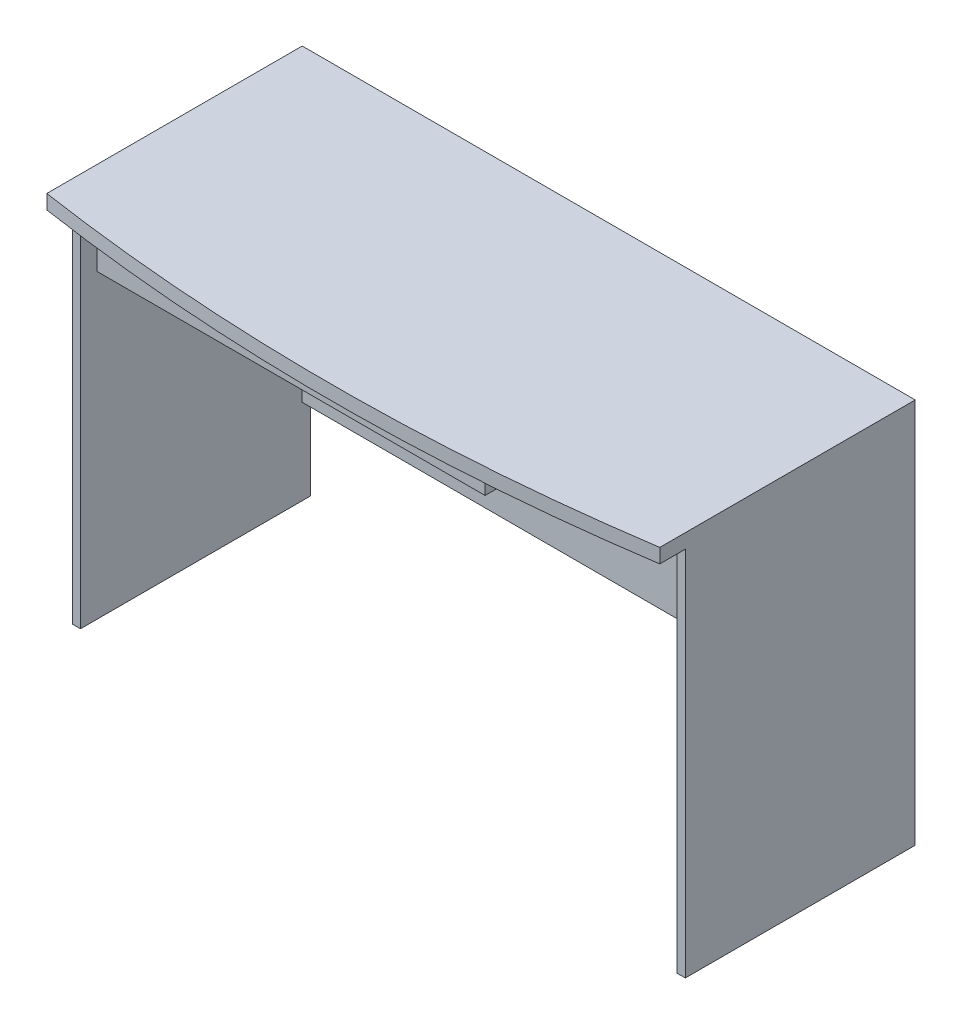
ISO-10303-21;
HEADER;
FILE_DESCRIPTION(('STEP AP214'),'2;1');
FILE_NAME('part.step','',(''),(''),'','','');
FILE_SCHEMA(('AUTOMOTIVE_DESIGN { 1 0 10303 214 1 1 1 1 }'));
ENDSEC;
DATA;
#1=APPLICATION_CONTEXT('core data for automotive mechanical design processes');
#2=APPLICATION_PROTOCOL_DEFINITION('international standard','automotive_design',2000,#1);
#3=PRODUCT_CONTEXT('',#1,'mechanical');
#4=PRODUCT('Part','Part','',(#3));
#5=PRODUCT_RELATED_PRODUCT_CATEGORY('part','',(#4));
#6=PRODUCT_DEFINITION_FORMATION('','',#4);
#7=PRODUCT_DEFINITION_CONTEXT('part definition',#1,'design');
#8=PRODUCT_DEFINITION('design','',#6,#7);
#9=PRODUCT_DEFINITION_SHAPE('','',#8);
#10=(LENGTH_UNIT() NAMED_UNIT(*) SI_UNIT(.MILLI.,.METRE.));
#11=(NAMED_UNIT(*) PLANE_ANGLE_UNIT() SI_UNIT($,.RADIAN.));
#12=(NAMED_UNIT(*) SI_UNIT($,.STERADIAN.) SOLID_ANGLE_UNIT());
#13=UNCERTAINTY_MEASURE_WITH_UNIT(LENGTH_MEASURE(1.E-05),#10,'distance_accuracy_value','');
#14=(GEOMETRIC_REPRESENTATION_CONTEXT(3) GLOBAL_UNCERTAINTY_ASSIGNED_CONTEXT((#13)) GLOBAL_UNIT_ASSIGNED_CONTEXT((#10,
#11,#12)) REPRESENTATION_CONTEXT('',''));
#15=CARTESIAN_POINT('',(0.,0.,0.));
#16=DIRECTION('',(0.,0.,1.));
#17=DIRECTION('',(1.,0.,0.));
#18=AXIS2_PLACEMENT_3D('',#15,#16,#17);
#19=CARTESIAN_POINT('',(0.,0.,-3727.5));
#20=DIRECTION('',(0.,1.,0.));
#21=DIRECTION('',(0.,0.,1.));
#22=AXIS2_PLACEMENT_3D('',#19,#20,#21);
#23=PLANE('',#22);
#24=DIRECTION('',(0.,0.,1.));
#25=VECTOR('',#24,1.);
#26=CARTESIAN_POINT('',(584.,0.,-250.));
#27=LINE('',#26,#25);
#28=CARTESIAN_POINT('',(584.,0.,-250.));
#29=VERTEX_POINT('',#28);
#30=CARTESIAN_POINT('',(584.,0.,200.));
#31=VERTEX_POINT('',#30);
#32=EDGE_CURVE('E221',#29,#31,#27,.T.);
#33=ORIENTED_EDGE('',*,*,#32,.T.);
#34=DIRECTION('',(1.,0.,0.));
#35=VECTOR('',#34,1.);
#36=CARTESIAN_POINT('',(600.,0.,200.));
#37=LINE('',#36,#35);
#38=CARTESIAN_POINT('',(600.,0.,200.));
#39=VERTEX_POINT('',#38);
#40=EDGE_CURVE('E196',#31,#39,#37,.T.);
#41=ORIENTED_EDGE('',*,*,#40,.T.);
#42=DIRECTION('',(0.,0.,-1.));
#43=VECTOR('',#42,1.);
#44=CARTESIAN_POINT('',(600.,0.,250.));
#45=LINE('',#44,#43);
#46=CARTESIAN_POINT('',(600.000000000001,0.,250.));
#47=VERTEX_POINT('',#46);
#48=EDGE_CURVE('E266',#47,#39,#45,.T.);
#49=ORIENTED_EDGE('',*,*,#48,.F.);
#50=CARTESIAN_POINT('',(0.,0.,-3727.5));
#51=DIRECTION('',(0.,1.,0.));
#52=DIRECTION('',(0.,0.,1.));
#53=AXIS2_PLACEMENT_3D('',#50,#51,#52);
#54=CIRCLE('',#53,4022.5);
#55=CARTESIAN_POINT('',(-600.,0.,250.));
#56=VERTEX_POINT('',#55);
#57=EDGE_CURVE('E271',#56,#47,#54,.T.);
#58=ORIENTED_EDGE('',*,*,#57,.F.);
#59=DIRECTION('',(0.,0.,1.));
#60=VECTOR('',#59,1.);
#61=CARTESIAN_POINT('',(-600.,0.,250.));
#62=LINE('',#61,#60);
#63=CARTESIAN_POINT('',(-600.,0.,200.));
#64=VERTEX_POINT('',#63);
#65=EDGE_CURVE('E283',#64,#56,#62,.T.);
#66=ORIENTED_EDGE('',*,*,#65,.F.);
#67=DIRECTION('',(-1.,0.,0.));
#68=VECTOR('',#67,1.);
#69=CARTESIAN_POINT('',(-600.,0.,200.));
#70=LINE('',#69,#68);
#71=CARTESIAN_POINT('',(-584.,0.,200.));
#72=VERTEX_POINT('',#71);
#73=EDGE_CURVE('E247',#72,#64,#70,.T.);
#74=ORIENTED_EDGE('',*,*,#73,.F.);
#75=DIRECTION('',(0.,0.,1.));
#76=VECTOR('',#75,1.);
#77=CARTESIAN_POINT('',(-584.,0.,-250.));
#78=LINE('',#77,#76);
#79=CARTESIAN_POINT('',(-584.,0.,-250.));
#80=VERTEX_POINT('',#79);
#81=EDGE_CURVE('E242',#80,#72,#78,.T.);
#82=ORIENTED_EDGE('',*,*,#81,.F.);
#83=DIRECTION('',(-1.,0.,0.));
#84=VECTOR('',#83,1.);
#85=CARTESIAN_POINT('',(-600.,0.,-250.));
#86=LINE('',#85,#84);
#87=EDGE_CURVE('E280',#29,#80,#86,.T.);
#88=ORIENTED_EDGE('',*,*,#87,.F.);
#89=EDGE_LOOP('',(#33,#41,#49,#58,#66,#74,#82,#88));
#90=FACE_BOUND('',#89,.T.);
#91=DIRECTION('',(0.,0.,-1.));
#92=VECTOR('',#91,1.);
#93=CARTESIAN_POINT('',(-517.,0.,235.));
#94=LINE('',#93,#92);
#95=CARTESIAN_POINT('',(-517.,0.,235.));
#96=VERTEX_POINT('',#95);
#97=CARTESIAN_POINT('',(-517.,0.,-195.));
#98=VERTEX_POINT('',#97);
#99=EDGE_CURVE('E181',#96,#98,#94,.T.);
#100=ORIENTED_EDGE('',*,*,#99,.F.);
#101=DIRECTION('',(-1.,0.,0.));
#102=VECTOR('',#101,1.);
#103=CARTESIAN_POINT('',(-517.,0.,235.));
#104=LINE('',#103,#102);
#105=CARTESIAN_POINT('',(243.,0.,235.));
#106=VERTEX_POINT('',#105);
#107=EDGE_CURVE('E178',#106,#96,#104,.T.);
#108=ORIENTED_EDGE('',*,*,#107,.F.);
#109=DIRECTION('',(0.,0.,1.));
#110=VECTOR('',#109,1.);
#111=CARTESIAN_POINT('',(243.,0.,235.));
#112=LINE('',#111,#110);
#113=CARTESIAN_POINT('',(243.,0.,-195.));
#114=VERTEX_POINT('',#113);
#115=EDGE_CURVE('E57',#114,#106,#112,.T.);
#116=ORIENTED_EDGE('',*,*,#115,.F.);
#117=DIRECTION('',(1.,0.,0.));
#118=VECTOR('',#117,1.);
#119=CARTESIAN_POINT('',(-517.,0.,-195.));
#120=LINE('',#119,#118);
#121=EDGE_CURVE('E52',#98,#114,#120,.T.);
#122=ORIENTED_EDGE('',*,*,#121,.F.);
#123=EDGE_LOOP('',(#100,#108,#116,#122));
#124=FACE_BOUND('',#123,.T.);
#125=ADVANCED_FACE('F37',(#90,#124),#23,.F.);
#126=CARTESIAN_POINT('',(-584.,-727.,-250.));
#127=DIRECTION('',(-1.,0.,0.));
#128=DIRECTION('',(0.,0.,1.));
#129=AXIS2_PLACEMENT_3D('',#126,#127,#128);
#130=PLANE('',#129);
#131=DIRECTION('',(0.,0.,-1.));
#132=VECTOR('',#131,1.);
#133=CARTESIAN_POINT('',(-584.,-560.,-250.));
#134=LINE('',#133,#132);
#135=CARTESIAN_POINT('',(-584.,-560.,-234.));
#136=VERTEX_POINT('',#135);
#137=CARTESIAN_POINT('',(-584.,-560.,-250.));
#138=VERTEX_POINT('',#137);
#139=EDGE_CURVE('E200',#136,#138,#134,.T.);
#140=ORIENTED_EDGE('',*,*,#139,.F.);
#141=DIRECTION('',(0.,-1.,0.));
#142=VECTOR('',#141,1.);
#143=CARTESIAN_POINT('',(-584.,-260.,-234.));
#144=LINE('',#143,#142);
#145=CARTESIAN_POINT('',(-584.,-260.,-234.));
#146=VERTEX_POINT('',#145);
#147=EDGE_CURVE('E185',#146,#136,#144,.T.);
#148=ORIENTED_EDGE('',*,*,#147,.F.);
#149=DIRECTION('',(0.,0.,1.));
#150=VECTOR('',#149,1.);
#151=CARTESIAN_POINT('',(-584.,-260.,-250.));
#152=LINE('',#151,#150);
#153=CARTESIAN_POINT('',(-584.,-260.,-250.));
#154=VERTEX_POINT('',#153);
#155=EDGE_CURVE('E182',#154,#146,#152,.T.);
#156=ORIENTED_EDGE('',*,*,#155,.F.);
#157=DIRECTION('',(0.,1.,0.));
#158=VECTOR('',#157,1.);
#159=CARTESIAN_POINT('',(-584.,-727.,-250.));
#160=LINE('',#159,#158);
#161=EDGE_CURVE('E263',#154,#80,#160,.T.);
#162=ORIENTED_EDGE('',*,*,#161,.T.);
#163=ORIENTED_EDGE('',*,*,#81,.T.);
#164=DIRECTION('',(0.,1.,0.));
#165=VECTOR('',#164,1.);
#166=CARTESIAN_POINT('',(-584.,-727.,200.));
#167=LINE('',#166,#165);
#168=CARTESIAN_POINT('',(-584.,-727.,200.));
#169=VERTEX_POINT('',#168);
#170=EDGE_CURVE('E260',#169,#72,#167,.T.);
#171=ORIENTED_EDGE('',*,*,#170,.F.);
#172=DIRECTION('',(0.,0.,1.));
#173=VECTOR('',#172,1.);
#174=CARTESIAN_POINT('',(-584.,-727.,-250.));
#175=LINE('',#174,#173);
#176=CARTESIAN_POINT('',(-584.,-727.,-250.));
#177=VERTEX_POINT('',#176);
#178=EDGE_CURVE('E249',#177,#169,#175,.T.);
#179=ORIENTED_EDGE('',*,*,#178,.F.);
#180=EDGE_CURVE('E264',#177,#138,#160,.T.);
#181=ORIENTED_EDGE('',*,*,#180,.T.);
#182=EDGE_LOOP('',(#140,#148,#156,#162,#163,#171,#179,#181));
#183=FACE_BOUND('',#182,.T.);
#184=ADVANCED_FACE('F335',(#183),#130,.F.);
#185=CARTESIAN_POINT('',(584.,-727.,-250.));
#186=DIRECTION('',(-1.,0.,0.));
#187=DIRECTION('',(0.,0.,1.));
#188=AXIS2_PLACEMENT_3D('',#185,#186,#187);
#189=PLANE('',#188);
#190=DIRECTION('',(0.,1.,0.));
#191=VECTOR('',#190,1.);
#192=CARTESIAN_POINT('',(584.,-260.,-234.));
#193=LINE('',#192,#191);
#194=CARTESIAN_POINT('',(584.,-560.,-234.));
#195=VERTEX_POINT('',#194);
#196=CARTESIAN_POINT('',(584.,-260.,-234.));
#197=VERTEX_POINT('',#196);
#198=EDGE_CURVE('E191',#195,#197,#193,.T.);
#199=ORIENTED_EDGE('',*,*,#198,.F.);
#200=DIRECTION('',(0.,0.,1.));
#201=VECTOR('',#200,1.);
#202=CARTESIAN_POINT('',(584.,-560.,-250.));
#203=LINE('',#202,#201);
#204=CARTESIAN_POINT('',(584.,-560.,-250.));
#205=VERTEX_POINT('',#204);
#206=EDGE_CURVE('E195',#205,#195,#203,.T.);
#207=ORIENTED_EDGE('',*,*,#206,.F.);
#208=DIRECTION('',(0.,1.,0.));
#209=VECTOR('',#208,1.);
#210=CARTESIAN_POINT('',(584.,-727.,-250.));
#211=LINE('',#210,#209);
#212=CARTESIAN_POINT('',(584.,-727.,-250.));
#213=VERTEX_POINT('',#212);
#214=EDGE_CURVE('E235',#213,#205,#211,.T.);
#215=ORIENTED_EDGE('',*,*,#214,.F.);
#216=DIRECTION('',(0.,0.,1.));
#217=VECTOR('',#216,1.);
#218=CARTESIAN_POINT('',(584.,-727.,-250.));
#219=LINE('',#218,#217);
#220=CARTESIAN_POINT('',(584.,-727.,200.));
#221=VERTEX_POINT('',#220);
#222=EDGE_CURVE('E224',#213,#221,#219,.T.);
#223=ORIENTED_EDGE('',*,*,#222,.T.);
#224=DIRECTION('',(0.,1.,0.));
#225=VECTOR('',#224,1.);
#226=CARTESIAN_POINT('',(584.,-727.,200.));
#227=LINE('',#226,#225);
#228=EDGE_CURVE('E238',#221,#31,#227,.T.);
#229=ORIENTED_EDGE('',*,*,#228,.T.);
#230=ORIENTED_EDGE('',*,*,#32,.F.);
#231=CARTESIAN_POINT('',(584.,-260.,-250.));
#232=VERTEX_POINT('',#231);
#233=EDGE_CURVE('E230',#232,#29,#211,.T.);
#234=ORIENTED_EDGE('',*,*,#233,.F.);
#235=DIRECTION('',(0.,0.,-1.));
#236=VECTOR('',#235,1.);
#237=CARTESIAN_POINT('',(584.,-260.,-250.));
#238=LINE('',#237,#236);
#239=EDGE_CURVE('E194',#197,#232,#238,.T.);
#240=ORIENTED_EDGE('',*,*,#239,.F.);
#241=EDGE_LOOP('',(#199,#207,#215,#223,#229,#230,#234,#240));
#242=FACE_BOUND('',#241,.T.);
#243=ADVANCED_FACE('F329',(#242),#189,.T.);
#244=CARTESIAN_POINT('',(600.,28.,250.));
#245=DIRECTION('',(-1.,0.,0.));
#246=DIRECTION('',(0.,0.,1.));
#247=AXIS2_PLACEMENT_3D('',#244,#245,#246);
#248=PLANE('',#247);
#249=ORIENTED_EDGE('',*,*,#48,.T.);
#250=DIRECTION('',(0.,1.,0.));
#251=VECTOR('',#250,1.);
#252=CARTESIAN_POINT('',(600.,-727.,200.));
#253=LINE('',#252,#251);
#254=CARTESIAN_POINT('',(600.,-727.,200.));
#255=VERTEX_POINT('',#254);
#256=EDGE_CURVE('E240',#255,#39,#253,.T.);
#257=ORIENTED_EDGE('',*,*,#256,.F.);
#258=DIRECTION('',(0.,0.,-1.));
#259=VECTOR('',#258,1.);
#260=CARTESIAN_POINT('',(600.,-727.,-250.));
#261=LINE('',#260,#259);
#262=CARTESIAN_POINT('',(600.,-727.,-250.));
#263=VERTEX_POINT('',#262);
#264=EDGE_CURVE('E217',#255,#263,#261,.T.);
#265=ORIENTED_EDGE('',*,*,#264,.T.);
#266=DIRECTION('',(0.,-1.,0.));
#267=VECTOR('',#266,1.);
#268=CARTESIAN_POINT('',(600.,28.,-250.));
#269=LINE('',#268,#267);
#270=CARTESIAN_POINT('',(600.,28.,-250.));
#271=VERTEX_POINT('',#270);
#272=EDGE_CURVE('E11',#271,#263,#269,.T.);
#273=ORIENTED_EDGE('',*,*,#272,.F.);
#274=DIRECTION('',(0.,0.,-1.));
#275=VECTOR('',#274,1.);
#276=CARTESIAN_POINT('',(600.,28.,250.));
#277=LINE('',#276,#275);
#278=CARTESIAN_POINT('',(600.000000000001,28.,250.));
#279=VERTEX_POINT('',#278);
#280=EDGE_CURVE('E267',#279,#271,#277,.T.);
#281=ORIENTED_EDGE('',*,*,#280,.F.);
#282=DIRECTION('',(0.,-1.,0.));
#283=VECTOR('',#282,1.);
#284=CARTESIAN_POINT('',(600.000000000001,28.,250.));
#285=LINE('',#284,#283);
#286=EDGE_CURVE('E277',#279,#47,#285,.T.);
#287=ORIENTED_EDGE('',*,*,#286,.T.);
#288=EDGE_LOOP('',(#249,#257,#265,#273,#281,#287));
#289=FACE_BOUND('',#288,.T.);
#290=ADVANCED_FACE('F39',(#289),#248,.F.);
#291=CARTESIAN_POINT('',(-600.,28.,-250.));
#292=DIRECTION('',(0.,0.,1.));
#293=DIRECTION('',(1.,0.,0.));
#294=AXIS2_PLACEMENT_3D('',#291,#292,#293);
#295=PLANE('',#294);
#296=ORIENTED_EDGE('',*,*,#161,.F.);
#297=DIRECTION('',(-1.,0.,0.));
#298=VECTOR('',#297,1.);
#299=CARTESIAN_POINT('',(884.426363690006,-260.,-250.));
#300=LINE('',#299,#298);
#301=EDGE_CURVE('E212',#232,#154,#300,.T.);
#302=ORIENTED_EDGE('',*,*,#301,.F.);
#303=ORIENTED_EDGE('',*,*,#233,.T.);
#304=ORIENTED_EDGE('',*,*,#87,.T.);
#305=EDGE_LOOP('',(#296,#302,#303,#304));
#306=FACE_BOUND('',#305,.T.);
#307=ORIENTED_EDGE('',*,*,#272,.T.);
#308=DIRECTION('',(-1.,0.,0.));
#309=VECTOR('',#308,1.);
#310=CARTESIAN_POINT('',(600.,-727.,-250.));
#311=LINE('',#310,#309);
#312=EDGE_CURVE('E227',#263,#213,#311,.T.);
#313=ORIENTED_EDGE('',*,*,#312,.T.);
#314=ORIENTED_EDGE('',*,*,#214,.T.);
#315=DIRECTION('',(-1.,0.,0.));
#316=VECTOR('',#315,1.);
#317=CARTESIAN_POINT('',(884.426363690006,-560.,-250.));
#318=LINE('',#317,#316);
#319=EDGE_CURVE('E203',#205,#138,#318,.T.);
#320=ORIENTED_EDGE('',*,*,#319,.T.);
#321=ORIENTED_EDGE('',*,*,#180,.F.);
#322=DIRECTION('',(1.,0.,0.));
#323=VECTOR('',#322,1.);
#324=CARTESIAN_POINT('',(-600.,-727.,-250.));
#325=LINE('',#324,#323);
#326=CARTESIAN_POINT('',(-600.,-727.,-250.));
#327=VERTEX_POINT('',#326);
#328=EDGE_CURVE('E246',#327,#177,#325,.T.);
#329=ORIENTED_EDGE('',*,*,#328,.F.);
#330=DIRECTION('',(0.,-1.,0.));
#331=VECTOR('',#330,1.);
#332=CARTESIAN_POINT('',(-600.,28.,-250.));
#333=LINE('',#332,#331);
#334=CARTESIAN_POINT('',(-600.,28.,-250.));
#335=VERTEX_POINT('',#334);
#336=EDGE_CURVE('E45',#335,#327,#333,.T.);
#337=ORIENTED_EDGE('',*,*,#336,.F.);
#338=DIRECTION('',(-1.,0.,0.));
#339=VECTOR('',#338,1.);
#340=CARTESIAN_POINT('',(-600.,28.,-250.));
#341=LINE('',#340,#339);
#342=EDGE_CURVE('E270',#271,#335,#341,.T.);
#343=ORIENTED_EDGE('',*,*,#342,.F.);
#344=EDGE_LOOP('',(#307,#313,#314,#320,#321,#329,#337,#343));
#345=FACE_BOUND('',#344,.T.);
#346=ADVANCED_FACE('F299',(#306,#345),#295,.F.);
#347=CARTESIAN_POINT('',(-600.,28.,250.));
#348=DIRECTION('',(1.,0.,0.));
#349=DIRECTION('',(0.,0.,-1.));
#350=AXIS2_PLACEMENT_3D('',#347,#348,#349);
#351=PLANE('',#350);
#352=ORIENTED_EDGE('',*,*,#336,.T.);
#353=DIRECTION('',(0.,0.,-1.));
#354=VECTOR('',#353,1.);
#355=CARTESIAN_POINT('',(-600.,-727.,-250.));
#356=LINE('',#355,#354);
#357=CARTESIAN_POINT('',(-600.,-727.,200.));
#358=VERTEX_POINT('',#357);
#359=EDGE_CURVE('E243',#358,#327,#356,.T.);
#360=ORIENTED_EDGE('',*,*,#359,.F.);
#361=DIRECTION('',(0.,1.,0.));
#362=VECTOR('',#361,1.);
#363=CARTESIAN_POINT('',(-600.,-727.,200.));
#364=LINE('',#363,#362);
#365=EDGE_CURVE('E253',#358,#64,#364,.T.);
#366=ORIENTED_EDGE('',*,*,#365,.T.);
#367=ORIENTED_EDGE('',*,*,#65,.T.);
#368=DIRECTION('',(0.,-1.,0.));
#369=VECTOR('',#368,1.);
#370=CARTESIAN_POINT('',(-600.,28.,250.));
#371=LINE('',#370,#369);
#372=CARTESIAN_POINT('',(-600.,28.,250.));
#373=VERTEX_POINT('',#372);
#374=EDGE_CURVE('E288',#373,#56,#371,.T.);
#375=ORIENTED_EDGE('',*,*,#374,.F.);
#376=DIRECTION('',(0.,0.,1.));
#377=VECTOR('',#376,1.);
#378=CARTESIAN_POINT('',(-600.,28.,250.));
#379=LINE('',#378,#377);
#380=EDGE_CURVE('E273',#335,#373,#379,.T.);
#381=ORIENTED_EDGE('',*,*,#380,.F.);
#382=EDGE_LOOP('',(#352,#360,#366,#367,#375,#381));
#383=FACE_BOUND('',#382,.T.);
#384=ADVANCED_FACE('F295',(#383),#351,.F.);
#385=CARTESIAN_POINT('',(0.,28.,-3727.5));
#386=DIRECTION('',(0.,-1.,0.));
#387=DIRECTION('',(0.,0.,-1.));
#388=AXIS2_PLACEMENT_3D('',#385,#386,#387);
#389=CYLINDRICAL_SURFACE('',#388,4022.5);
#390=ORIENTED_EDGE('',*,*,#57,.T.);
#391=ORIENTED_EDGE('',*,*,#286,.F.);
#392=CARTESIAN_POINT('',(0.,28.,-3727.5));
#393=DIRECTION('',(0.,1.,0.));
#394=DIRECTION('',(0.,0.,1.));
#395=AXIS2_PLACEMENT_3D('',#392,#393,#394);
#396=CIRCLE('',#395,4022.5);
#397=EDGE_CURVE('E275',#373,#279,#396,.T.);
#398=ORIENTED_EDGE('',*,*,#397,.F.);
#399=ORIENTED_EDGE('',*,*,#374,.T.);
#400=EDGE_LOOP('',(#390,#391,#398,#399));
#401=FACE_BOUND('',#400,.T.);
#402=ADVANCED_FACE('F312',(#401),#389,.T.);
#403=CARTESIAN_POINT('',(0.,28.,-3727.5));
#404=DIRECTION('',(0.,1.,0.));
#405=DIRECTION('',(0.,0.,1.));
#406=AXIS2_PLACEMENT_3D('',#403,#404,#405);
#407=PLANE('',#406);
#408=ORIENTED_EDGE('',*,*,#280,.T.);
#409=ORIENTED_EDGE('',*,*,#342,.T.);
#410=ORIENTED_EDGE('',*,*,#380,.T.);
#411=ORIENTED_EDGE('',*,*,#397,.T.);
#412=EDGE_LOOP('',(#408,#409,#410,#411));
#413=FACE_BOUND('',#412,.T.);
#414=ADVANCED_FACE('F321',(#413),#407,.T.);
#415=CARTESIAN_POINT('',(-600.,-727.,200.));
#416=DIRECTION('',(0.,0.,-1.));
#417=DIRECTION('',(-1.,0.,0.));
#418=AXIS2_PLACEMENT_3D('',#415,#416,#417);
#419=PLANE('',#418);
#420=ORIENTED_EDGE('',*,*,#73,.T.);
#421=ORIENTED_EDGE('',*,*,#365,.F.);
#422=DIRECTION('',(-1.,0.,0.));
#423=VECTOR('',#422,1.);
#424=CARTESIAN_POINT('',(-600.,-727.,200.));
#425=LINE('',#424,#423);
#426=EDGE_CURVE('E251',#169,#358,#425,.T.);
#427=ORIENTED_EDGE('',*,*,#426,.F.);
#428=ORIENTED_EDGE('',*,*,#170,.T.);
#429=EDGE_LOOP('',(#420,#421,#427,#428));
#430=FACE_BOUND('',#429,.T.);
#431=ADVANCED_FACE('F307',(#430),#419,.F.);
#432=CARTESIAN_POINT('',(0.,-727.,0.));
#433=DIRECTION('',(0.,1.,0.));
#434=DIRECTION('',(0.,0.,1.));
#435=AXIS2_PLACEMENT_3D('',#432,#433,#434);
#436=PLANE('',#435);
#437=ORIENTED_EDGE('',*,*,#359,.T.);
#438=ORIENTED_EDGE('',*,*,#328,.T.);
#439=ORIENTED_EDGE('',*,*,#178,.T.);
#440=ORIENTED_EDGE('',*,*,#426,.T.);
#441=EDGE_LOOP('',(#437,#438,#439,#440));
#442=FACE_BOUND('',#441,.T.);
#443=ADVANCED_FACE('F302',(#442),#436,.F.);
#444=CARTESIAN_POINT('',(600.,-727.,200.));
#445=DIRECTION('',(0.,0.,1.));
#446=DIRECTION('',(1.,0.,0.));
#447=AXIS2_PLACEMENT_3D('',#444,#445,#446);
#448=PLANE('',#447);
#449=ORIENTED_EDGE('',*,*,#40,.F.);
#450=ORIENTED_EDGE('',*,*,#228,.F.);
#451=DIRECTION('',(1.,0.,0.));
#452=VECTOR('',#451,1.);
#453=CARTESIAN_POINT('',(600.,-727.,200.));
#454=LINE('',#453,#452);
#455=EDGE_CURVE('E220',#221,#255,#454,.T.);
#456=ORIENTED_EDGE('',*,*,#455,.T.);
#457=ORIENTED_EDGE('',*,*,#256,.T.);
#458=EDGE_LOOP('',(#449,#450,#456,#457));
#459=FACE_BOUND('',#458,.T.);
#460=ADVANCED_FACE('F378',(#459),#448,.T.);
#461=CARTESIAN_POINT('',(0.,-727.,0.));
#462=DIRECTION('',(0.,1.,0.));
#463=DIRECTION('',(0.,0.,1.));
#464=AXIS2_PLACEMENT_3D('',#461,#462,#463);
#465=PLANE('',#464);
#466=ORIENTED_EDGE('',*,*,#264,.F.);
#467=ORIENTED_EDGE('',*,*,#455,.F.);
#468=ORIENTED_EDGE('',*,*,#222,.F.);
#469=ORIENTED_EDGE('',*,*,#312,.F.);
#470=EDGE_LOOP('',(#466,#467,#468,#469));
#471=FACE_BOUND('',#470,.T.);
#472=ADVANCED_FACE('F326',(#471),#465,.F.);
#473=CARTESIAN_POINT('',(884.426363690006,-560.,-250.));
#474=DIRECTION('',(0.,1.,0.));
#475=DIRECTION('',(0.,0.,1.));
#476=AXIS2_PLACEMENT_3D('',#473,#474,#475);
#477=PLANE('',#476);
#478=ORIENTED_EDGE('',*,*,#319,.F.);
#479=ORIENTED_EDGE('',*,*,#206,.T.);
#480=DIRECTION('',(-1.,0.,0.));
#481=VECTOR('',#480,1.);
#482=CARTESIAN_POINT('',(884.426363690006,-560.,-234.));
#483=LINE('',#482,#481);
#484=EDGE_CURVE('E206',#195,#136,#483,.T.);
#485=ORIENTED_EDGE('',*,*,#484,.T.);
#486=ORIENTED_EDGE('',*,*,#139,.T.);
#487=EDGE_LOOP('',(#478,#479,#485,#486));
#488=FACE_BOUND('',#487,.T.);
#489=ADVANCED_FACE('F333',(#488),#477,.F.);
#490=CARTESIAN_POINT('',(884.426363690006,-260.,-234.));
#491=DIRECTION('',(0.,0.,-1.));
#492=DIRECTION('',(0.,1.,0.));
#493=AXIS2_PLACEMENT_3D('',#490,#491,#492);
#494=PLANE('',#493);
#495=ORIENTED_EDGE('',*,*,#484,.F.);
#496=ORIENTED_EDGE('',*,*,#198,.T.);
#497=DIRECTION('',(-1.,0.,0.));
#498=VECTOR('',#497,1.);
#499=CARTESIAN_POINT('',(884.426363690006,-260.,-234.));
#500=LINE('',#499,#498);
#501=EDGE_CURVE('E209',#197,#146,#500,.T.);
#502=ORIENTED_EDGE('',*,*,#501,.T.);
#503=ORIENTED_EDGE('',*,*,#147,.T.);
#504=EDGE_LOOP('',(#495,#496,#502,#503));
#505=FACE_BOUND('',#504,.T.);
#506=ADVANCED_FACE('F346',(#505),#494,.F.);
#507=CARTESIAN_POINT('',(884.426363690006,-260.,-250.));
#508=DIRECTION('',(0.,-1.,0.));
#509=DIRECTION('',(0.,0.,-1.));
#510=AXIS2_PLACEMENT_3D('',#507,#508,#509);
#511=PLANE('',#510);
#512=ORIENTED_EDGE('',*,*,#501,.F.);
#513=ORIENTED_EDGE('',*,*,#239,.T.);
#514=ORIENTED_EDGE('',*,*,#301,.T.);
#515=ORIENTED_EDGE('',*,*,#155,.T.);
#516=EDGE_LOOP('',(#512,#513,#514,#515));
#517=FACE_BOUND('',#516,.T.);
#518=ADVANCED_FACE('F344',(#517),#511,.F.);
#519=CARTESIAN_POINT('',(-517.,-70.,235.));
#520=DIRECTION('',(1.,0.,0.));
#521=DIRECTION('',(0.,0.,-1.));
#522=AXIS2_PLACEMENT_3D('',#519,#520,#521);
#523=PLANE('',#522);
#524=ORIENTED_EDGE('',*,*,#99,.T.);
#525=DIRECTION('',(0.,1.,0.));
#526=VECTOR('',#525,1.);
#527=CARTESIAN_POINT('',(-517.,-70.,-195.));
#528=LINE('',#527,#526);
#529=CARTESIAN_POINT('',(-517.,-70.,-195.));
#530=VERTEX_POINT('',#529);
#531=EDGE_CURVE('E162',#530,#98,#528,.T.);
#532=ORIENTED_EDGE('',*,*,#531,.F.);
#533=DIRECTION('',(0.,0.,-1.));
#534=VECTOR('',#533,1.);
#535=CARTESIAN_POINT('',(-517.,-70.,235.));
#536=LINE('',#535,#534);
#537=CARTESIAN_POINT('',(-517.,-70.,235.));
#538=VERTEX_POINT('',#537);
#539=EDGE_CURVE('E169',#538,#530,#536,.T.);
#540=ORIENTED_EDGE('',*,*,#539,.F.);
#541=DIRECTION('',(0.,1.,0.));
#542=VECTOR('',#541,1.);
#543=CARTESIAN_POINT('',(-517.,-70.,235.));
#544=LINE('',#543,#542);
#545=EDGE_CURVE('E535',#538,#96,#544,.T.);
#546=ORIENTED_EDGE('',*,*,#545,.T.);
#547=EDGE_LOOP('',(#524,#532,#540,#546));
#548=FACE_BOUND('',#547,.T.);
#549=ADVANCED_FACE('F180',(#548),#523,.F.);
#550=CARTESIAN_POINT('',(-517.,-70.,-195.));
#551=DIRECTION('',(0.,0.,1.));
#552=DIRECTION('',(1.,0.,0.));
#553=AXIS2_PLACEMENT_3D('',#550,#551,#552);
#554=PLANE('',#553);
#555=ORIENTED_EDGE('',*,*,#121,.T.);
#556=DIRECTION('',(0.,1.,0.));
#557=VECTOR('',#556,1.);
#558=CARTESIAN_POINT('',(243.,-70.,-195.));
#559=LINE('',#558,#557);
#560=CARTESIAN_POINT('',(243.,-70.,-195.));
#561=VERTEX_POINT('',#560);
#562=EDGE_CURVE('E165',#561,#114,#559,.T.);
#563=ORIENTED_EDGE('',*,*,#562,.F.);
#564=DIRECTION('',(1.,0.,0.));
#565=VECTOR('',#564,1.);
#566=CARTESIAN_POINT('',(-517.,-70.,-195.));
#567=LINE('',#566,#565);
#568=EDGE_CURVE('E158',#530,#561,#567,.T.);
#569=ORIENTED_EDGE('',*,*,#568,.F.);
#570=ORIENTED_EDGE('',*,*,#531,.T.);
#571=EDGE_LOOP('',(#555,#563,#569,#570));
#572=FACE_BOUND('',#571,.T.);
#573=ADVANCED_FACE('F160',(#572),#554,.F.);
#574=CARTESIAN_POINT('',(243.,-70.,235.));
#575=DIRECTION('',(-1.,0.,0.));
#576=DIRECTION('',(0.,0.,1.));
#577=AXIS2_PLACEMENT_3D('',#574,#575,#576);
#578=PLANE('',#577);
#579=ORIENTED_EDGE('',*,*,#115,.T.);
#580=DIRECTION('',(0.,1.,0.));
#581=VECTOR('',#580,1.);
#582=CARTESIAN_POINT('',(243.,-70.,235.));
#583=LINE('',#582,#581);
#584=CARTESIAN_POINT('',(243.,-70.,235.));
#585=VERTEX_POINT('',#584);
#586=EDGE_CURVE('E187',#585,#106,#583,.T.);
#587=ORIENTED_EDGE('',*,*,#586,.F.);
#588=DIRECTION('',(0.,0.,1.));
#589=VECTOR('',#588,1.);
#590=CARTESIAN_POINT('',(243.,-70.,235.));
#591=LINE('',#590,#589);
#592=EDGE_CURVE('E168',#561,#585,#591,.T.);
#593=ORIENTED_EDGE('',*,*,#592,.F.);
#594=ORIENTED_EDGE('',*,*,#562,.T.);
#595=EDGE_LOOP('',(#579,#587,#593,#594));
#596=FACE_BOUND('',#595,.T.);
#597=ADVANCED_FACE('F489',(#596),#578,.F.);
#598=CARTESIAN_POINT('',(-517.,-70.,235.));
#599=DIRECTION('',(0.,0.,-1.));
#600=DIRECTION('',(-1.,0.,0.));
#601=AXIS2_PLACEMENT_3D('',#598,#599,#600);
#602=PLANE('',#601);
#603=ORIENTED_EDGE('',*,*,#107,.T.);
#604=ORIENTED_EDGE('',*,*,#545,.F.);
#605=DIRECTION('',(-1.,0.,0.));
#606=VECTOR('',#605,1.);
#607=CARTESIAN_POINT('',(-517.,-70.,235.));
#608=LINE('',#607,#606);
#609=EDGE_CURVE('E174',#585,#538,#608,.T.);
#610=ORIENTED_EDGE('',*,*,#609,.F.);
#611=ORIENTED_EDGE('',*,*,#586,.T.);
#612=EDGE_LOOP('',(#603,#604,#610,#611));
#613=FACE_BOUND('',#612,.T.);
#614=ADVANCED_FACE('F499',(#613),#602,.F.);
#615=CARTESIAN_POINT('',(0.,-70.,0.));
#616=DIRECTION('',(0.,-1.,0.));
#617=DIRECTION('',(0.,0.,-1.));
#618=AXIS2_PLACEMENT_3D('',#615,#616,#617);
#619=PLANE('',#618);
#620=ORIENTED_EDGE('',*,*,#539,.T.);
#621=ORIENTED_EDGE('',*,*,#568,.T.);
#622=ORIENTED_EDGE('',*,*,#592,.T.);
#623=ORIENTED_EDGE('',*,*,#609,.T.);
#624=EDGE_LOOP('',(#620,#621,#622,#623));
#625=FACE_BOUND('',#624,.T.);
#626=ADVANCED_FACE('F172',(#625),#619,.T.);
#627=CLOSED_SHELL('',(#125,#184,#243,#290,#346,#384,#402,#414,#431,#443,#460,#472,#489,#506,
#518,#549,#573,#597,#614,#626));
#628=MANIFOLD_SOLID_BREP('B2',#627);
#629=ADVANCED_BREP_SHAPE_REPRESENTATION('',(#18,#628),#14);
#630=SHAPE_DEFINITION_REPRESENTATION(#9,#629);
ENDSEC;
END-ISO-10303-21;
